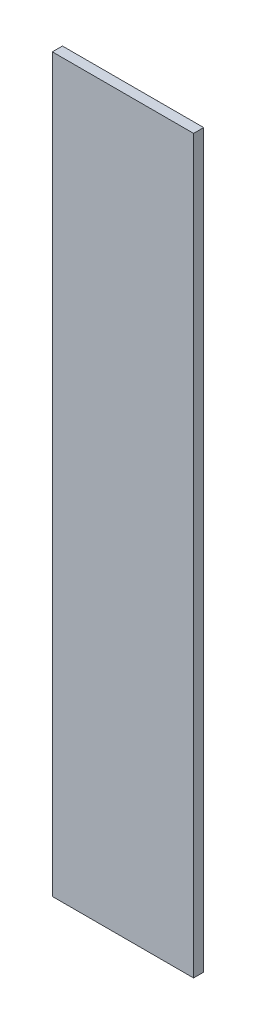
ISO-10303-21;
HEADER;
FILE_DESCRIPTION(('STEP AP214'),'2;1');
FILE_NAME('part.step','',(''),(''),'','','');
FILE_SCHEMA(('AUTOMOTIVE_DESIGN { 1 0 10303 214 1 1 1 1 }'));
ENDSEC;
DATA;
#1=APPLICATION_CONTEXT('core data for automotive mechanical design processes');
#2=APPLICATION_PROTOCOL_DEFINITION('international standard','automotive_design',2000,#1);
#3=PRODUCT_CONTEXT('',#1,'mechanical');
#4=PRODUCT('Part','Part','',(#3));
#5=PRODUCT_RELATED_PRODUCT_CATEGORY('part','',(#4));
#6=PRODUCT_DEFINITION_FORMATION('','',#4);
#7=PRODUCT_DEFINITION_CONTEXT('part definition',#1,'design');
#8=PRODUCT_DEFINITION('design','',#6,#7);
#9=PRODUCT_DEFINITION_SHAPE('','',#8);
#10=(LENGTH_UNIT() NAMED_UNIT(*) SI_UNIT(.MILLI.,.METRE.));
#11=(NAMED_UNIT(*) PLANE_ANGLE_UNIT() SI_UNIT($,.RADIAN.));
#12=(NAMED_UNIT(*) SI_UNIT($,.STERADIAN.) SOLID_ANGLE_UNIT());
#13=UNCERTAINTY_MEASURE_WITH_UNIT(LENGTH_MEASURE(1.E-05),#10,'distance_accuracy_value','');
#14=(GEOMETRIC_REPRESENTATION_CONTEXT(3) GLOBAL_UNCERTAINTY_ASSIGNED_CONTEXT((#13)) GLOBAL_UNIT_ASSIGNED_CONTEXT((#10,
#11,#12)) REPRESENTATION_CONTEXT('',''));
#15=CARTESIAN_POINT('',(0.,0.,0.));
#16=DIRECTION('',(0.,0.,1.));
#17=DIRECTION('',(1.,0.,0.));
#18=AXIS2_PLACEMENT_3D('',#15,#16,#17);
#19=CARTESIAN_POINT('',(88.9,-460.375,12.7));
#20=DIRECTION('',(-1.,0.,0.));
#21=DIRECTION('',(0.,0.,1.));
#22=AXIS2_PLACEMENT_3D('',#19,#20,#21);
#23=PLANE('',#22);
#24=DIRECTION('',(0.,1.,0.));
#25=VECTOR('',#24,1.);
#26=CARTESIAN_POINT('',(88.9,-460.375,0.));
#27=LINE('',#26,#25);
#28=CARTESIAN_POINT('',(88.9,-460.375,0.));
#29=VERTEX_POINT('',#28);
#30=CARTESIAN_POINT('',(88.9,460.375,0.));
#31=VERTEX_POINT('',#30);
#32=EDGE_CURVE('E107',#29,#31,#27,.T.);
#33=ORIENTED_EDGE('',*,*,#32,.T.);
#34=DIRECTION('',(0.,0.,-1.));
#35=VECTOR('',#34,1.);
#36=CARTESIAN_POINT('',(88.9,460.375,12.7));
#37=LINE('',#36,#35);
#38=CARTESIAN_POINT('',(88.9,460.375,12.7));
#39=VERTEX_POINT('',#38);
#40=EDGE_CURVE('E11',#39,#31,#37,.T.);
#41=ORIENTED_EDGE('',*,*,#40,.F.);
#42=DIRECTION('',(0.,1.,0.));
#43=VECTOR('',#42,1.);
#44=CARTESIAN_POINT('',(88.9,-460.375,12.7));
#45=LINE('',#44,#43);
#46=CARTESIAN_POINT('',(88.9,-460.375,12.7));
#47=VERTEX_POINT('',#46);
#48=EDGE_CURVE('E91',#47,#39,#45,.T.);
#49=ORIENTED_EDGE('',*,*,#48,.F.);
#50=DIRECTION('',(0.,0.,-1.));
#51=VECTOR('',#50,1.);
#52=CARTESIAN_POINT('',(88.9,-460.375,12.7));
#53=LINE('',#52,#51);
#54=EDGE_CURVE('E103',#47,#29,#53,.T.);
#55=ORIENTED_EDGE('',*,*,#54,.T.);
#56=EDGE_LOOP('',(#33,#41,#49,#55));
#57=FACE_BOUND('',#56,.T.);
#58=ADVANCED_FACE('F39',(#57),#23,.F.);
#59=CARTESIAN_POINT('',(-88.9,460.375,12.7));
#60=DIRECTION('',(0.,-1.,0.));
#61=DIRECTION('',(0.,0.,-1.));
#62=AXIS2_PLACEMENT_3D('',#59,#60,#61);
#63=PLANE('',#62);
#64=DIRECTION('',(-1.,0.,0.));
#65=VECTOR('',#64,1.);
#66=CARTESIAN_POINT('',(-88.9,460.375,0.));
#67=LINE('',#66,#65);
#68=CARTESIAN_POINT('',(-88.9,460.375,0.));
#69=VERTEX_POINT('',#68);
#70=EDGE_CURVE('E96',#31,#69,#67,.T.);
#71=ORIENTED_EDGE('',*,*,#70,.T.);
#72=DIRECTION('',(0.,0.,-1.));
#73=VECTOR('',#72,1.);
#74=CARTESIAN_POINT('',(-88.9,460.375,12.7));
#75=LINE('',#74,#73);
#76=CARTESIAN_POINT('',(-88.9,460.375,12.7));
#77=VERTEX_POINT('',#76);
#78=EDGE_CURVE('E48',#77,#69,#75,.T.);
#79=ORIENTED_EDGE('',*,*,#78,.F.);
#80=DIRECTION('',(-1.,0.,0.));
#81=VECTOR('',#80,1.);
#82=CARTESIAN_POINT('',(-88.9,460.375,12.7));
#83=LINE('',#82,#81);
#84=EDGE_CURVE('E86',#39,#77,#83,.T.);
#85=ORIENTED_EDGE('',*,*,#84,.F.);
#86=ORIENTED_EDGE('',*,*,#40,.T.);
#87=EDGE_LOOP('',(#71,#79,#85,#86));
#88=FACE_BOUND('',#87,.T.);
#89=ADVANCED_FACE('F95',(#88),#63,.F.);
#90=CARTESIAN_POINT('',(-88.9,-460.375,12.7));
#91=DIRECTION('',(1.,0.,0.));
#92=DIRECTION('',(0.,0.,-1.));
#93=AXIS2_PLACEMENT_3D('',#90,#91,#92);
#94=PLANE('',#93);
#95=DIRECTION('',(0.,-1.,0.));
#96=VECTOR('',#95,1.);
#97=CARTESIAN_POINT('',(-88.9,-460.375,0.));
#98=LINE('',#97,#96);
#99=CARTESIAN_POINT('',(-88.9,-460.375,0.));
#100=VERTEX_POINT('',#99);
#101=EDGE_CURVE('E73',#69,#100,#98,.T.);
#102=ORIENTED_EDGE('',*,*,#101,.T.);
#103=DIRECTION('',(0.,0.,-1.));
#104=VECTOR('',#103,1.);
#105=CARTESIAN_POINT('',(-88.9,-460.375,12.7));
#106=LINE('',#105,#104);
#107=CARTESIAN_POINT('',(-88.9,-460.375,12.7));
#108=VERTEX_POINT('',#107);
#109=EDGE_CURVE('E98',#108,#100,#106,.T.);
#110=ORIENTED_EDGE('',*,*,#109,.F.);
#111=DIRECTION('',(0.,-1.,0.));
#112=VECTOR('',#111,1.);
#113=CARTESIAN_POINT('',(-88.9,-460.375,12.7));
#114=LINE('',#113,#112);
#115=EDGE_CURVE('E89',#77,#108,#114,.T.);
#116=ORIENTED_EDGE('',*,*,#115,.F.);
#117=ORIENTED_EDGE('',*,*,#78,.T.);
#118=EDGE_LOOP('',(#102,#110,#116,#117));
#119=FACE_BOUND('',#118,.T.);
#120=ADVANCED_FACE('F99',(#119),#94,.F.);
#121=CARTESIAN_POINT('',(-88.9,-460.375,12.7));
#122=DIRECTION('',(0.,1.,0.));
#123=DIRECTION('',(0.,0.,1.));
#124=AXIS2_PLACEMENT_3D('',#121,#122,#123);
#125=PLANE('',#124);
#126=DIRECTION('',(1.,0.,0.));
#127=VECTOR('',#126,1.);
#128=CARTESIAN_POINT('',(-88.9,-460.375,0.));
#129=LINE('',#128,#127);
#130=EDGE_CURVE('E79',#100,#29,#129,.T.);
#131=ORIENTED_EDGE('',*,*,#130,.T.);
#132=ORIENTED_EDGE('',*,*,#54,.F.);
#133=DIRECTION('',(1.,0.,0.));
#134=VECTOR('',#133,1.);
#135=CARTESIAN_POINT('',(-88.9,-460.375,12.7));
#136=LINE('',#135,#134);
#137=EDGE_CURVE('E56',#108,#47,#136,.T.);
#138=ORIENTED_EDGE('',*,*,#137,.F.);
#139=ORIENTED_EDGE('',*,*,#109,.T.);
#140=EDGE_LOOP('',(#131,#132,#138,#139));
#141=FACE_BOUND('',#140,.T.);
#142=ADVANCED_FACE('F120',(#141),#125,.F.);
#143=CARTESIAN_POINT('',(0.,0.,12.7));
#144=DIRECTION('',(0.,0.,-1.));
#145=DIRECTION('',(-1.,0.,0.));
#146=AXIS2_PLACEMENT_3D('',#143,#144,#145);
#147=PLANE('',#146);
#148=ORIENTED_EDGE('',*,*,#48,.T.);
#149=ORIENTED_EDGE('',*,*,#84,.T.);
#150=ORIENTED_EDGE('',*,*,#115,.T.);
#151=ORIENTED_EDGE('',*,*,#137,.T.);
#152=EDGE_LOOP('',(#148,#149,#150,#151));
#153=FACE_BOUND('',#152,.T.);
#154=ADVANCED_FACE('F87',(#153),#147,.F.);
#155=CARTESIAN_POINT('',(0.,0.,0.));
#156=DIRECTION('',(0.,0.,-1.));
#157=DIRECTION('',(-1.,0.,0.));
#158=AXIS2_PLACEMENT_3D('',#155,#156,#157);
#159=PLANE('',#158);
#160=ORIENTED_EDGE('',*,*,#32,.F.);
#161=ORIENTED_EDGE('',*,*,#130,.F.);
#162=ORIENTED_EDGE('',*,*,#101,.F.);
#163=ORIENTED_EDGE('',*,*,#70,.F.);
#164=EDGE_LOOP('',(#160,#161,#162,#163));
#165=FACE_BOUND('',#164,.T.);
#166=ADVANCED_FACE('F123',(#165),#159,.T.);
#167=CLOSED_SHELL('',(#58,#89,#120,#142,#154,#166));
#168=MANIFOLD_SOLID_BREP('B2',#167);
#169=ADVANCED_BREP_SHAPE_REPRESENTATION('',(#18,#168),#14);
#170=SHAPE_DEFINITION_REPRESENTATION(#9,#169);
ENDSEC;
END-ISO-10303-21;
